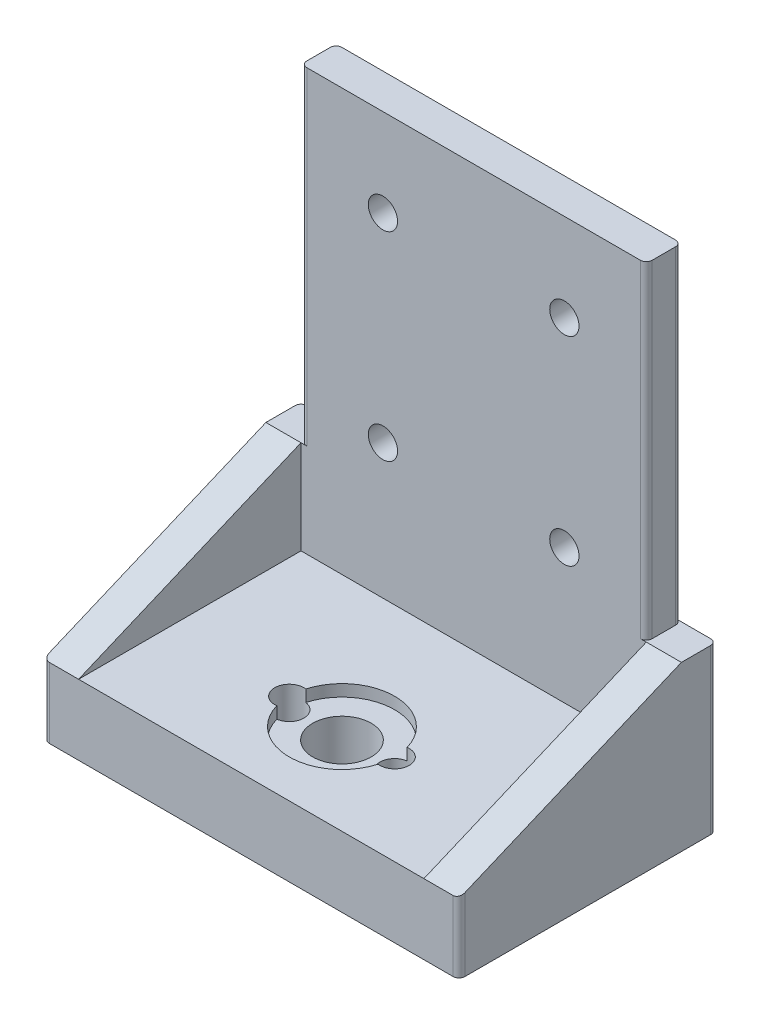
ISO-10303-21;
HEADER;
FILE_DESCRIPTION(('STEP AP214'),'2;1');
FILE_NAME('part.step','',(''),(''),'','','');
FILE_SCHEMA(('AUTOMOTIVE_DESIGN { 1 0 10303 214 1 1 1 1 }'));
ENDSEC;
DATA;
#1=APPLICATION_CONTEXT('core data for automotive mechanical design processes');
#2=APPLICATION_PROTOCOL_DEFINITION('international standard','automotive_design',2000,#1);
#3=PRODUCT_CONTEXT('',#1,'mechanical');
#4=PRODUCT('Part','Part','',(#3));
#5=PRODUCT_RELATED_PRODUCT_CATEGORY('part','',(#4));
#6=PRODUCT_DEFINITION_FORMATION('','',#4);
#7=PRODUCT_DEFINITION_CONTEXT('part definition',#1,'design');
#8=PRODUCT_DEFINITION('design','',#6,#7);
#9=PRODUCT_DEFINITION_SHAPE('','',#8);
#10=(LENGTH_UNIT() NAMED_UNIT(*) SI_UNIT(.MILLI.,.METRE.));
#11=(NAMED_UNIT(*) PLANE_ANGLE_UNIT() SI_UNIT($,.RADIAN.));
#12=(NAMED_UNIT(*) SI_UNIT($,.STERADIAN.) SOLID_ANGLE_UNIT());
#13=UNCERTAINTY_MEASURE_WITH_UNIT(LENGTH_MEASURE(1.E-05),#10,'distance_accuracy_value','');
#14=(GEOMETRIC_REPRESENTATION_CONTEXT(3) GLOBAL_UNCERTAINTY_ASSIGNED_CONTEXT((#13)) GLOBAL_UNIT_ASSIGNED_CONTEXT((#10,
#11,#12)) REPRESENTATION_CONTEXT('',''));
#15=CARTESIAN_POINT('',(0.,0.,0.));
#16=DIRECTION('',(0.,0.,1.));
#17=DIRECTION('',(1.,0.,0.));
#18=AXIS2_PLACEMENT_3D('',#15,#16,#17);
#19=CARTESIAN_POINT('',(17.75,0.,-7.75));
#20=DIRECTION('',(0.,-1.,0.));
#21=DIRECTION('',(0.,0.,-1.));
#22=AXIS2_PLACEMENT_3D('',#19,#20,#21);
#23=CYLINDRICAL_SURFACE('',#22,4.50000000000001);
#24=CARTESIAN_POINT('',(17.75,6.,-7.75));
#25=DIRECTION('',(0.,-1.,0.));
#26=DIRECTION('',(0.,0.,-1.));
#27=AXIS2_PLACEMENT_3D('',#24,#25,#26);
#28=CIRCLE('',#27,4.50000000000001);
#29=CARTESIAN_POINT('',(22.0763888888889,6.,-6.51211503680724));
#30=VERTEX_POINT('',#29);
#31=CARTESIAN_POINT('',(13.4236111111111,6.,-6.51211503680724));
#32=VERTEX_POINT('',#31);
#33=EDGE_CURVE('E227',#30,#32,#28,.T.);
#34=ORIENTED_EDGE('',*,*,#33,.F.);
#35=DIRECTION('',(0.,-1.,0.));
#36=VECTOR('',#35,1.);
#37=CARTESIAN_POINT('',(22.0763888888889,21.,-6.51211503680724));
#38=LINE('',#37,#36);
#39=CARTESIAN_POINT('',(22.0763888888889,5.,-6.51211503680724));
#40=VERTEX_POINT('',#39);
#41=EDGE_CURVE('E210',#30,#40,#38,.T.);
#42=ORIENTED_EDGE('',*,*,#41,.T.);
#43=CARTESIAN_POINT('',(17.75,5.,-7.75));
#44=DIRECTION('',(0.,-1.,0.));
#45=DIRECTION('',(0.,0.,-1.));
#46=AXIS2_PLACEMENT_3D('',#43,#44,#45);
#47=CIRCLE('',#46,4.50000000000001);
#48=CARTESIAN_POINT('',(13.4236111111111,5.,-6.51211503680724));
#49=VERTEX_POINT('',#48);
#50=EDGE_CURVE('E225',#40,#49,#47,.T.);
#51=ORIENTED_EDGE('',*,*,#50,.T.);
#52=DIRECTION('',(0.,-1.,0.));
#53=VECTOR('',#52,1.);
#54=CARTESIAN_POINT('',(13.4236111111111,21.,-6.51211503680724));
#55=LINE('',#54,#53);
#56=EDGE_CURVE('E595',#49,#32,#55,.F.);
#57=ORIENTED_EDGE('',*,*,#56,.T.);
#58=EDGE_LOOP('',(#34,#42,#51,#57));
#59=FACE_BOUND('',#58,.T.);
#60=ADVANCED_FACE('F45',(#59),#23,.F.);
#61=CARTESIAN_POINT('',(0.,6.,0.));
#62=DIRECTION('',(0.,-0.921635375138065,-0.388057000058133));
#63=DIRECTION('',(0.,0.388057000058133,-0.921635375138065));
#64=AXIS2_PLACEMENT_3D('',#61,#62,#63);
#65=PLANE('',#64);
#66=DIRECTION('',(0.,0.388057000058133,-0.921635375138065));
#67=VECTOR('',#66,1.);
#68=CARTESIAN_POINT('',(0.,6.,0.));
#69=LINE('',#68,#67);
#70=CARTESIAN_POINT('',(0.,6.21052631578947,-0.5));
#71=VERTEX_POINT('',#70);
#72=CARTESIAN_POINT('',(0.,14.,-19.));
#73=VERTEX_POINT('',#72);
#74=EDGE_CURVE('E303',#71,#73,#69,.T.);
#75=ORIENTED_EDGE('',*,*,#74,.F.);
#76=CARTESIAN_POINT('',(0.5,6.21052631578947,-0.5));
#77=DIRECTION('',(0.,-0.921635375138065,-0.388057000058133));
#78=DIRECTION('',(0.,-0.388057000058133,0.921635375138065));
#79=AXIS2_PLACEMENT_3D('',#76,#77,#78);
#80=ELLIPSE('',#79,0.542513898107587,0.5);
#81=CARTESIAN_POINT('',(0.5,6.,0.));
#82=VERTEX_POINT('',#81);
#83=EDGE_CURVE('E69',#71,#82,#80,.F.);
#84=ORIENTED_EDGE('',*,*,#83,.T.);
#85=DIRECTION('',(1.,0.,0.));
#86=VECTOR('',#85,1.);
#87=CARTESIAN_POINT('',(0.,6.,0.));
#88=LINE('',#87,#86);
#89=CARTESIAN_POINT('',(3.,6.,0.));
#90=VERTEX_POINT('',#89);
#91=EDGE_CURVE('E318',#82,#90,#88,.T.);
#92=ORIENTED_EDGE('',*,*,#91,.T.);
#93=DIRECTION('',(0.,0.388057000058133,-0.921635375138065));
#94=VECTOR('',#93,1.);
#95=CARTESIAN_POINT('',(3.,6.,0.));
#96=LINE('',#95,#94);
#97=CARTESIAN_POINT('',(3.,14.,-19.));
#98=VERTEX_POINT('',#97);
#99=EDGE_CURVE('E344',#90,#98,#96,.T.);
#100=ORIENTED_EDGE('',*,*,#99,.T.);
#101=DIRECTION('',(1.,0.,0.));
#102=VECTOR('',#101,1.);
#103=CARTESIAN_POINT('',(0.,14.,-19.));
#104=LINE('',#103,#102);
#105=EDGE_CURVE('E314',#73,#98,#104,.T.);
#106=ORIENTED_EDGE('',*,*,#105,.F.);
#107=EDGE_LOOP('',(#75,#84,#92,#100,#106));
#108=FACE_BOUND('',#107,.T.);
#109=ADVANCED_FACE('F524',(#108),#65,.F.);
#110=CARTESIAN_POINT('',(0.,42.,0.));
#111=DIRECTION('',(1.,0.,0.));
#112=DIRECTION('',(0.,0.,-1.));
#113=AXIS2_PLACEMENT_3D('',#110,#111,#112);
#114=PLANE('',#113);
#115=DIRECTION('',(0.,0.,1.));
#116=VECTOR('',#115,1.);
#117=CARTESIAN_POINT('',(0.,14.,-22.));
#118=LINE('',#117,#116);
#119=CARTESIAN_POINT('',(0.,14.,-21.5));
#120=VERTEX_POINT('',#119);
#121=EDGE_CURVE('E269',#120,#73,#118,.T.);
#122=ORIENTED_EDGE('',*,*,#121,.F.);
#123=DIRECTION('',(0.,-1.,0.));
#124=VECTOR('',#123,1.);
#125=CARTESIAN_POINT('',(0.,42.,-21.5));
#126=LINE('',#125,#124);
#127=CARTESIAN_POINT('',(0.,0.,-21.5));
#128=VERTEX_POINT('',#127);
#129=EDGE_CURVE('E427',#120,#128,#126,.T.);
#130=ORIENTED_EDGE('',*,*,#129,.T.);
#131=DIRECTION('',(0.,0.,1.));
#132=VECTOR('',#131,1.);
#133=CARTESIAN_POINT('',(0.,0.,0.));
#134=LINE('',#133,#132);
#135=CARTESIAN_POINT('',(0.,0.,-0.5));
#136=VERTEX_POINT('',#135);
#137=EDGE_CURVE('E313',#128,#136,#134,.T.);
#138=ORIENTED_EDGE('',*,*,#137,.T.);
#139=DIRECTION('',(0.,-1.,0.));
#140=VECTOR('',#139,1.);
#141=CARTESIAN_POINT('',(0.,42.,-0.5));
#142=LINE('',#141,#140);
#143=EDGE_CURVE('E424',#136,#71,#142,.F.);
#144=ORIENTED_EDGE('',*,*,#143,.T.);
#145=ORIENTED_EDGE('',*,*,#74,.T.);
#146=EDGE_LOOP('',(#122,#130,#138,#144,#145));
#147=FACE_BOUND('',#146,.T.);
#148=ADVANCED_FACE('F530',(#147),#114,.F.);
#149=CARTESIAN_POINT('',(0.,42.,0.));
#150=DIRECTION('',(0.,0.,-1.));
#151=DIRECTION('',(-1.,0.,0.));
#152=AXIS2_PLACEMENT_3D('',#149,#150,#151);
#153=PLANE('',#152);
#154=ORIENTED_EDGE('',*,*,#91,.F.);
#155=DIRECTION('',(0.,-1.,0.));
#156=VECTOR('',#155,1.);
#157=CARTESIAN_POINT('',(0.5,42.,0.));
#158=LINE('',#157,#156);
#159=CARTESIAN_POINT('',(0.5,0.,0.));
#160=VERTEX_POINT('',#159);
#161=EDGE_CURVE('E459',#82,#160,#158,.T.);
#162=ORIENTED_EDGE('',*,*,#161,.T.);
#163=DIRECTION('',(1.,0.,0.));
#164=VECTOR('',#163,1.);
#165=CARTESIAN_POINT('',(0.,0.,0.));
#166=LINE('',#165,#164);
#167=CARTESIAN_POINT('',(35.,0.,0.));
#168=VERTEX_POINT('',#167);
#169=EDGE_CURVE('E330',#160,#168,#166,.T.);
#170=ORIENTED_EDGE('',*,*,#169,.T.);
#171=DIRECTION('',(0.,-1.,0.));
#172=VECTOR('',#171,1.);
#173=CARTESIAN_POINT('',(35.,42.,0.));
#174=LINE('',#173,#172);
#175=CARTESIAN_POINT('',(35.,6.,0.));
#176=VERTEX_POINT('',#175);
#177=EDGE_CURVE('E456',#168,#176,#174,.F.);
#178=ORIENTED_EDGE('',*,*,#177,.T.);
#179=CARTESIAN_POINT('',(32.5,6.,0.));
#180=VERTEX_POINT('',#179);
#181=EDGE_CURVE('E306',#180,#176,#88,.T.);
#182=ORIENTED_EDGE('',*,*,#181,.F.);
#183=DIRECTION('',(1.,0.,0.));
#184=VECTOR('',#183,1.);
#185=CARTESIAN_POINT('',(3.,6.,0.));
#186=LINE('',#185,#184);
#187=EDGE_CURVE('E250',#90,#180,#186,.T.);
#188=ORIENTED_EDGE('',*,*,#187,.F.);
#189=EDGE_LOOP('',(#154,#162,#170,#178,#182,#188));
#190=FACE_BOUND('',#189,.T.);
#191=ADVANCED_FACE('F554',(#190),#153,.F.);
#192=CARTESIAN_POINT('',(35.5,42.,0.));
#193=DIRECTION('',(-1.,0.,0.));
#194=DIRECTION('',(0.,0.,1.));
#195=AXIS2_PLACEMENT_3D('',#192,#193,#194);
#196=PLANE('',#195);
#197=DIRECTION('',(0.,0.,-1.));
#198=VECTOR('',#197,1.);
#199=CARTESIAN_POINT('',(35.5,0.,0.));
#200=LINE('',#199,#198);
#201=CARTESIAN_POINT('',(35.5,0.,-0.5));
#202=VERTEX_POINT('',#201);
#203=CARTESIAN_POINT('',(35.5,0.,-21.5));
#204=VERTEX_POINT('',#203);
#205=EDGE_CURVE('E334',#202,#204,#200,.T.);
#206=ORIENTED_EDGE('',*,*,#205,.T.);
#207=DIRECTION('',(0.,-1.,0.));
#208=VECTOR('',#207,1.);
#209=CARTESIAN_POINT('',(35.5,42.,-21.5));
#210=LINE('',#209,#208);
#211=CARTESIAN_POINT('',(35.5,14.,-21.5));
#212=VERTEX_POINT('',#211);
#213=EDGE_CURVE('E450',#204,#212,#210,.F.);
#214=ORIENTED_EDGE('',*,*,#213,.T.);
#215=DIRECTION('',(0.,0.,-1.));
#216=VECTOR('',#215,1.);
#217=CARTESIAN_POINT('',(35.5,14.,-22.));
#218=LINE('',#217,#216);
#219=CARTESIAN_POINT('',(35.5,14.,-19.));
#220=VERTEX_POINT('',#219);
#221=EDGE_CURVE('E290',#220,#212,#218,.T.);
#222=ORIENTED_EDGE('',*,*,#221,.F.);
#223=DIRECTION('',(0.,0.388057000058133,-0.921635375138065));
#224=VECTOR('',#223,1.);
#225=CARTESIAN_POINT('',(35.5,6.,0.));
#226=LINE('',#225,#224);
#227=CARTESIAN_POINT('',(35.5,6.21052631578947,-0.5));
#228=VERTEX_POINT('',#227);
#229=EDGE_CURVE('E282',#228,#220,#226,.T.);
#230=ORIENTED_EDGE('',*,*,#229,.F.);
#231=DIRECTION('',(0.,-1.,0.));
#232=VECTOR('',#231,1.);
#233=CARTESIAN_POINT('',(35.5,42.,-0.5));
#234=LINE('',#233,#232);
#235=EDGE_CURVE('E446',#228,#202,#234,.T.);
#236=ORIENTED_EDGE('',*,*,#235,.T.);
#237=EDGE_LOOP('',(#206,#214,#222,#230,#236));
#238=FACE_BOUND('',#237,.T.);
#239=ADVANCED_FACE('F545',(#238),#196,.F.);
#240=CARTESIAN_POINT('',(0.,42.,-22.));
#241=DIRECTION('',(0.,0.,1.));
#242=DIRECTION('',(1.,0.,0.));
#243=AXIS2_PLACEMENT_3D('',#240,#241,#242);
#244=PLANE('',#243);
#245=CARTESIAN_POINT('',(10.,17.5,-22.));
#246=DIRECTION('',(0.,0.,-1.));
#247=DIRECTION('',(-1.,0.,0.));
#248=AXIS2_PLACEMENT_3D('',#245,#246,#247);
#249=CIRCLE('',#248,1.25);
#250=CARTESIAN_POINT('',(8.75,17.5,-22.));
#251=VERTEX_POINT('',#250);
#252=EDGE_CURVE('E370',#251,#251,#249,.T.);
#253=ORIENTED_EDGE('',*,*,#252,.F.);
#254=EDGE_LOOP('',(#253));
#255=FACE_BOUND('',#254,.T.);
#256=CARTESIAN_POINT('',(25.5,17.5,-22.));
#257=DIRECTION('',(0.,0.,-1.));
#258=DIRECTION('',(-1.,0.,0.));
#259=AXIS2_PLACEMENT_3D('',#256,#257,#258);
#260=CIRCLE('',#259,1.25);
#261=CARTESIAN_POINT('',(24.25,17.5,-22.));
#262=VERTEX_POINT('',#261);
#263=EDGE_CURVE('E369',#262,#262,#260,.T.);
#264=ORIENTED_EDGE('',*,*,#263,.F.);
#265=EDGE_LOOP('',(#264));
#266=FACE_BOUND('',#265,.T.);
#267=CARTESIAN_POINT('',(25.5,34.5,-22.));
#268=DIRECTION('',(0.,0.,-1.));
#269=DIRECTION('',(-1.,0.,0.));
#270=AXIS2_PLACEMENT_3D('',#267,#268,#269);
#271=CIRCLE('',#270,1.25);
#272=CARTESIAN_POINT('',(24.25,34.5,-22.));
#273=VERTEX_POINT('',#272);
#274=EDGE_CURVE('E364',#273,#273,#271,.T.);
#275=ORIENTED_EDGE('',*,*,#274,.F.);
#276=EDGE_LOOP('',(#275));
#277=FACE_BOUND('',#276,.T.);
#278=CARTESIAN_POINT('',(10.,34.5,-22.));
#279=DIRECTION('',(0.,0.,-1.));
#280=DIRECTION('',(-1.,0.,0.));
#281=AXIS2_PLACEMENT_3D('',#278,#279,#280);
#282=CIRCLE('',#281,1.25);
#283=CARTESIAN_POINT('',(8.75,34.5,-22.));
#284=VERTEX_POINT('',#283);
#285=EDGE_CURVE('E359',#284,#284,#282,.T.);
#286=ORIENTED_EDGE('',*,*,#285,.F.);
#287=EDGE_LOOP('',(#286));
#288=FACE_BOUND('',#287,.T.);
#289=DIRECTION('',(-1.,0.,0.));
#290=VECTOR('',#289,1.);
#291=CARTESIAN_POINT('',(0.,14.,-22.));
#292=LINE('',#291,#290);
#293=CARTESIAN_POINT('',(3.5,14.,-22.));
#294=VERTEX_POINT('',#293);
#295=CARTESIAN_POINT('',(0.5,14.,-22.));
#296=VERTEX_POINT('',#295);
#297=EDGE_CURVE('E278',#294,#296,#292,.T.);
#298=ORIENTED_EDGE('',*,*,#297,.F.);
#299=DIRECTION('',(0.,1.,0.));
#300=VECTOR('',#299,1.);
#301=CARTESIAN_POINT('',(3.5,42.,-22.));
#302=LINE('',#301,#300);
#303=CARTESIAN_POINT('',(3.5,42.,-22.));
#304=VERTEX_POINT('',#303);
#305=EDGE_CURVE('E381',#294,#304,#302,.T.);
#306=ORIENTED_EDGE('',*,*,#305,.T.);
#307=DIRECTION('',(-1.,0.,0.));
#308=VECTOR('',#307,1.);
#309=CARTESIAN_POINT('',(0.,42.,-22.));
#310=LINE('',#309,#308);
#311=CARTESIAN_POINT('',(32.,42.,-22.));
#312=VERTEX_POINT('',#311);
#313=EDGE_CURVE('E321',#312,#304,#310,.T.);
#314=ORIENTED_EDGE('',*,*,#313,.F.);
#315=DIRECTION('',(0.,1.,0.));
#316=VECTOR('',#315,1.);
#317=CARTESIAN_POINT('',(32.,42.,-22.));
#318=LINE('',#317,#316);
#319=CARTESIAN_POINT('',(32.,14.,-22.));
#320=VERTEX_POINT('',#319);
#321=EDGE_CURVE('E377',#312,#320,#318,.F.);
#322=ORIENTED_EDGE('',*,*,#321,.T.);
#323=DIRECTION('',(-1.,0.,0.));
#324=VECTOR('',#323,1.);
#325=CARTESIAN_POINT('',(35.5,14.,-22.));
#326=LINE('',#325,#324);
#327=CARTESIAN_POINT('',(35.,14.,-22.));
#328=VERTEX_POINT('',#327);
#329=EDGE_CURVE('E297',#328,#320,#326,.T.);
#330=ORIENTED_EDGE('',*,*,#329,.F.);
#331=DIRECTION('',(0.,-1.,0.));
#332=VECTOR('',#331,1.);
#333=CARTESIAN_POINT('',(35.,42.,-22.));
#334=LINE('',#333,#332);
#335=CARTESIAN_POINT('',(35.,0.,-22.));
#336=VERTEX_POINT('',#335);
#337=EDGE_CURVE('E219',#328,#336,#334,.T.);
#338=ORIENTED_EDGE('',*,*,#337,.T.);
#339=DIRECTION('',(-1.,0.,0.));
#340=VECTOR('',#339,1.);
#341=CARTESIAN_POINT('',(0.,0.,-22.));
#342=LINE('',#341,#340);
#343=CARTESIAN_POINT('',(0.5,0.,-22.));
#344=VERTEX_POINT('',#343);
#345=EDGE_CURVE('E326',#336,#344,#342,.T.);
#346=ORIENTED_EDGE('',*,*,#345,.T.);
#347=DIRECTION('',(0.,-1.,0.));
#348=VECTOR('',#347,1.);
#349=CARTESIAN_POINT('',(0.5,42.,-22.));
#350=LINE('',#349,#348);
#351=EDGE_CURVE('E374',#344,#296,#350,.F.);
#352=ORIENTED_EDGE('',*,*,#351,.T.);
#353=EDGE_LOOP('',(#298,#306,#314,#322,#330,#338,#346,#352));
#354=FACE_BOUND('',#353,.T.);
#355=ADVANCED_FACE('F499',(#255,#266,#277,#288,#354),#244,.F.);
#356=CARTESIAN_POINT('',(0.,42.,0.));
#357=DIRECTION('',(0.,-1.,0.));
#358=DIRECTION('',(0.,0.,-1.));
#359=AXIS2_PLACEMENT_3D('',#356,#357,#358);
#360=PLANE('',#359);
#361=ORIENTED_EDGE('',*,*,#313,.T.);
#362=CARTESIAN_POINT('',(3.5,42.,-21.5));
#363=DIRECTION('',(0.,-1.,0.));
#364=DIRECTION('',(0.,0.,-1.));
#365=AXIS2_PLACEMENT_3D('',#362,#363,#364);
#366=CIRCLE('',#365,0.5);
#367=CARTESIAN_POINT('',(3.,42.,-21.5));
#368=VERTEX_POINT('',#367);
#369=EDGE_CURVE('E394',#304,#368,#366,.F.);
#370=ORIENTED_EDGE('',*,*,#369,.T.);
#371=DIRECTION('',(0.,0.,-1.));
#372=VECTOR('',#371,1.);
#373=CARTESIAN_POINT('',(3.,42.,-22.));
#374=LINE('',#373,#372);
#375=CARTESIAN_POINT('',(3.,42.,-19.5));
#376=VERTEX_POINT('',#375);
#377=EDGE_CURVE('E274',#376,#368,#374,.T.);
#378=ORIENTED_EDGE('',*,*,#377,.F.);
#379=CARTESIAN_POINT('',(3.5,42.,-19.5));
#380=DIRECTION('',(0.,-1.,0.));
#381=DIRECTION('',(0.,0.,-1.));
#382=AXIS2_PLACEMENT_3D('',#379,#380,#381);
#383=CIRCLE('',#382,0.5);
#384=CARTESIAN_POINT('',(3.5,42.,-19.));
#385=VERTEX_POINT('',#384);
#386=EDGE_CURVE('E385',#376,#385,#383,.F.);
#387=ORIENTED_EDGE('',*,*,#386,.T.);
#388=DIRECTION('',(1.,0.,0.));
#389=VECTOR('',#388,1.);
#390=CARTESIAN_POINT('',(0.,42.,-19.));
#391=LINE('',#390,#389);
#392=CARTESIAN_POINT('',(32.,42.,-19.));
#393=VERTEX_POINT('',#392);
#394=EDGE_CURVE('E309',#385,#393,#391,.T.);
#395=ORIENTED_EDGE('',*,*,#394,.T.);
#396=CARTESIAN_POINT('',(32.,42.,-19.5));
#397=DIRECTION('',(0.,-1.,0.));
#398=DIRECTION('',(0.,0.,-1.));
#399=AXIS2_PLACEMENT_3D('',#396,#397,#398);
#400=CIRCLE('',#399,0.5);
#401=CARTESIAN_POINT('',(32.5,42.,-19.5));
#402=VERTEX_POINT('',#401);
#403=EDGE_CURVE('E388',#393,#402,#400,.F.);
#404=ORIENTED_EDGE('',*,*,#403,.T.);
#405=DIRECTION('',(0.,0.,1.));
#406=VECTOR('',#405,1.);
#407=CARTESIAN_POINT('',(32.5,42.,-22.));
#408=LINE('',#407,#406);
#409=CARTESIAN_POINT('',(32.5,42.,-21.5));
#410=VERTEX_POINT('',#409);
#411=EDGE_CURVE('E286',#410,#402,#408,.T.);
#412=ORIENTED_EDGE('',*,*,#411,.F.);
#413=CARTESIAN_POINT('',(32.,42.,-21.5));
#414=DIRECTION('',(0.,-1.,0.));
#415=DIRECTION('',(0.,0.,-1.));
#416=AXIS2_PLACEMENT_3D('',#413,#414,#415);
#417=CIRCLE('',#416,0.5);
#418=EDGE_CURVE('E391',#410,#312,#417,.F.);
#419=ORIENTED_EDGE('',*,*,#418,.T.);
#420=EDGE_LOOP('',(#361,#370,#378,#387,#395,#404,#412,#419));
#421=FACE_BOUND('',#420,.T.);
#422=ADVANCED_FACE('F489',(#421),#360,.F.);
#423=CARTESIAN_POINT('',(0.,0.,0.));
#424=DIRECTION('',(0.,-1.,0.));
#425=DIRECTION('',(0.,0.,-1.));
#426=AXIS2_PLACEMENT_3D('',#423,#424,#425);
#427=PLANE('',#426);
#428=CARTESIAN_POINT('',(22.25,0.,-7.75));
#429=DIRECTION('',(0.,-1.,0.));
#430=DIRECTION('',(0.,0.,-1.));
#431=AXIS2_PLACEMENT_3D('',#428,#429,#430);
#432=CIRCLE('',#431,1.24999999999999);
#433=CARTESIAN_POINT('',(22.25,0.,-8.99999999999999));
#434=VERTEX_POINT('',#433);
#435=EDGE_CURVE('E358',#434,#434,#432,.T.);
#436=ORIENTED_EDGE('',*,*,#435,.F.);
#437=EDGE_LOOP('',(#436));
#438=FACE_BOUND('',#437,.T.);
#439=CARTESIAN_POINT('',(13.25,0.,-7.75));
#440=DIRECTION('',(0.,-1.,0.));
#441=DIRECTION('',(0.,0.,-1.));
#442=AXIS2_PLACEMENT_3D('',#439,#440,#441);
#443=CIRCLE('',#442,1.24999999999999);
#444=CARTESIAN_POINT('',(13.25,0.,-8.99999999999999));
#445=VERTEX_POINT('',#444);
#446=EDGE_CURVE('E600',#445,#445,#443,.T.);
#447=ORIENTED_EDGE('',*,*,#446,.F.);
#448=EDGE_LOOP('',(#447));
#449=FACE_BOUND('',#448,.T.);
#450=CARTESIAN_POINT('',(17.75,0.,-7.75));
#451=DIRECTION('',(0.,-1.,0.));
#452=DIRECTION('',(0.,0.,-1.));
#453=AXIS2_PLACEMENT_3D('',#450,#451,#452);
#454=CIRCLE('',#453,2.50000000000001);
#455=CARTESIAN_POINT('',(17.75,0.,-10.25));
#456=VERTEX_POINT('',#455);
#457=EDGE_CURVE('E242',#456,#456,#454,.T.);
#458=ORIENTED_EDGE('',*,*,#457,.F.);
#459=EDGE_LOOP('',(#458));
#460=FACE_BOUND('',#459,.T.);
#461=ORIENTED_EDGE('',*,*,#137,.F.);
#462=CARTESIAN_POINT('',(0.5,0.,-21.5));
#463=DIRECTION('',(0.,-1.,0.));
#464=DIRECTION('',(0.,0.,-1.));
#465=AXIS2_PLACEMENT_3D('',#462,#463,#464);
#466=CIRCLE('',#465,0.5);
#467=EDGE_CURVE('E440',#128,#344,#466,.T.);
#468=ORIENTED_EDGE('',*,*,#467,.T.);
#469=ORIENTED_EDGE('',*,*,#345,.F.);
#470=CARTESIAN_POINT('',(35.,0.,-21.5));
#471=DIRECTION('',(0.,-1.,0.));
#472=DIRECTION('',(0.,0.,-1.));
#473=AXIS2_PLACEMENT_3D('',#470,#471,#472);
#474=CIRCLE('',#473,0.5);
#475=EDGE_CURVE('E437',#336,#204,#474,.T.);
#476=ORIENTED_EDGE('',*,*,#475,.T.);
#477=ORIENTED_EDGE('',*,*,#205,.F.);
#478=CARTESIAN_POINT('',(35.,0.,-0.5));
#479=DIRECTION('',(0.,-1.,0.));
#480=DIRECTION('',(0.,0.,-1.));
#481=AXIS2_PLACEMENT_3D('',#478,#479,#480);
#482=CIRCLE('',#481,0.5);
#483=EDGE_CURVE('E431',#202,#168,#482,.T.);
#484=ORIENTED_EDGE('',*,*,#483,.T.);
#485=ORIENTED_EDGE('',*,*,#169,.F.);
#486=CARTESIAN_POINT('',(0.5,0.,-0.5));
#487=DIRECTION('',(0.,-1.,0.));
#488=DIRECTION('',(0.,0.,-1.));
#489=AXIS2_PLACEMENT_3D('',#486,#487,#488);
#490=CIRCLE('',#489,0.5);
#491=EDGE_CURVE('E434',#160,#136,#490,.T.);
#492=ORIENTED_EDGE('',*,*,#491,.T.);
#493=EDGE_LOOP('',(#461,#468,#469,#476,#477,#484,#485,#492));
#494=FACE_BOUND('',#493,.T.);
#495=ADVANCED_FACE('F537',(#438,#449,#460,#494),#427,.T.);
#496=CARTESIAN_POINT('',(0.,14.,-19.));
#497=DIRECTION('',(0.,0.,-1.));
#498=DIRECTION('',(-1.,0.,0.));
#499=AXIS2_PLACEMENT_3D('',#496,#497,#498);
#500=PLANE('',#499);
#501=CARTESIAN_POINT('',(10.,17.5,-19.));
#502=DIRECTION('',(0.,0.,-1.));
#503=DIRECTION('',(-1.,0.,0.));
#504=AXIS2_PLACEMENT_3D('',#501,#502,#503);
#505=CIRCLE('',#504,1.25);
#506=CARTESIAN_POINT('',(8.75,17.5,-19.));
#507=VERTEX_POINT('',#506);
#508=EDGE_CURVE('E365',#507,#507,#505,.T.);
#509=ORIENTED_EDGE('',*,*,#508,.T.);
#510=EDGE_LOOP('',(#509));
#511=FACE_BOUND('',#510,.T.);
#512=CARTESIAN_POINT('',(25.5,17.5,-19.));
#513=DIRECTION('',(0.,0.,-1.));
#514=DIRECTION('',(-1.,0.,0.));
#515=AXIS2_PLACEMENT_3D('',#512,#513,#514);
#516=CIRCLE('',#515,1.25);
#517=CARTESIAN_POINT('',(24.25,17.5,-19.));
#518=VERTEX_POINT('',#517);
#519=EDGE_CURVE('E886',#518,#518,#516,.T.);
#520=ORIENTED_EDGE('',*,*,#519,.T.);
#521=EDGE_LOOP('',(#520));
#522=FACE_BOUND('',#521,.T.);
#523=CARTESIAN_POINT('',(25.5,34.5,-19.));
#524=DIRECTION('',(0.,0.,-1.));
#525=DIRECTION('',(-1.,0.,0.));
#526=AXIS2_PLACEMENT_3D('',#523,#524,#525);
#527=CIRCLE('',#526,1.25);
#528=CARTESIAN_POINT('',(24.25,34.5,-19.));
#529=VERTEX_POINT('',#528);
#530=EDGE_CURVE('E360',#529,#529,#527,.T.);
#531=ORIENTED_EDGE('',*,*,#530,.T.);
#532=EDGE_LOOP('',(#531));
#533=FACE_BOUND('',#532,.T.);
#534=CARTESIAN_POINT('',(10.,34.5,-19.));
#535=DIRECTION('',(0.,0.,-1.));
#536=DIRECTION('',(-1.,0.,0.));
#537=AXIS2_PLACEMENT_3D('',#534,#535,#536);
#538=CIRCLE('',#537,1.25);
#539=CARTESIAN_POINT('',(8.75,34.5,-19.));
#540=VERTEX_POINT('',#539);
#541=EDGE_CURVE('E354',#540,#540,#538,.T.);
#542=ORIENTED_EDGE('',*,*,#541,.T.);
#543=EDGE_LOOP('',(#542));
#544=FACE_BOUND('',#543,.T.);
#545=DIRECTION('',(-1.,0.,0.));
#546=VECTOR('',#545,1.);
#547=CARTESIAN_POINT('',(0.,14.,-19.));
#548=LINE('',#547,#546);
#549=CARTESIAN_POINT('',(32.5,14.,-19.));
#550=VERTEX_POINT('',#549);
#551=CARTESIAN_POINT('',(32.,14.,-19.));
#552=VERTEX_POINT('',#551);
#553=EDGE_CURVE('E61',#550,#552,#548,.T.);
#554=ORIENTED_EDGE('',*,*,#553,.T.);
#555=DIRECTION('',(0.,1.,0.));
#556=VECTOR('',#555,1.);
#557=CARTESIAN_POINT('',(32.,14.,-19.));
#558=LINE('',#557,#556);
#559=EDGE_CURVE('E420',#552,#393,#558,.T.);
#560=ORIENTED_EDGE('',*,*,#559,.T.);
#561=ORIENTED_EDGE('',*,*,#394,.F.);
#562=DIRECTION('',(0.,1.,0.));
#563=VECTOR('',#562,1.);
#564=CARTESIAN_POINT('',(3.5,14.,-19.));
#565=LINE('',#564,#563);
#566=CARTESIAN_POINT('',(3.5,14.,-19.));
#567=VERTEX_POINT('',#566);
#568=EDGE_CURVE('E414',#385,#567,#565,.F.);
#569=ORIENTED_EDGE('',*,*,#568,.T.);
#570=DIRECTION('',(-1.,0.,0.));
#571=VECTOR('',#570,1.);
#572=CARTESIAN_POINT('',(0.,14.,-19.));
#573=LINE('',#572,#571);
#574=EDGE_CURVE('E411',#567,#98,#573,.T.);
#575=ORIENTED_EDGE('',*,*,#574,.T.);
#576=DIRECTION('',(0.,-1.,0.));
#577=VECTOR('',#576,1.);
#578=CARTESIAN_POINT('',(3.,6.,-19.));
#579=LINE('',#578,#577);
#580=CARTESIAN_POINT('',(3.,6.,-19.));
#581=VERTEX_POINT('',#580);
#582=EDGE_CURVE('E246',#98,#581,#579,.T.);
#583=ORIENTED_EDGE('',*,*,#582,.T.);
#584=DIRECTION('',(1.,0.,0.));
#585=VECTOR('',#584,1.);
#586=CARTESIAN_POINT('',(3.,6.,-19.));
#587=LINE('',#586,#585);
#588=CARTESIAN_POINT('',(32.5,6.,-19.));
#589=VERTEX_POINT('',#588);
#590=EDGE_CURVE('E249',#581,#589,#587,.T.);
#591=ORIENTED_EDGE('',*,*,#590,.T.);
#592=DIRECTION('',(0.,1.,0.));
#593=VECTOR('',#592,1.);
#594=CARTESIAN_POINT('',(32.5,6.,-19.));
#595=LINE('',#594,#593);
#596=EDGE_CURVE('E254',#589,#550,#595,.T.);
#597=ORIENTED_EDGE('',*,*,#596,.T.);
#598=EDGE_LOOP('',(#554,#560,#561,#569,#575,#583,#591,#597));
#599=FACE_BOUND('',#598,.T.);
#600=ADVANCED_FACE('F482',(#511,#522,#533,#544,#599),#500,.F.);
#601=ORIENTED_EDGE('',*,*,#181,.T.);
#602=CARTESIAN_POINT('',(35.,6.21052631578947,-0.5));
#603=DIRECTION('',(0.,-0.921635375138065,-0.388057000058133));
#604=DIRECTION('',(0.,-0.388057000058133,0.921635375138065));
#605=AXIS2_PLACEMENT_3D('',#602,#603,#604);
#606=ELLIPSE('',#605,0.542513898107587,0.5);
#607=EDGE_CURVE('E465',#176,#228,#606,.F.);
#608=ORIENTED_EDGE('',*,*,#607,.T.);
#609=ORIENTED_EDGE('',*,*,#229,.T.);
#610=DIRECTION('',(1.,0.,0.));
#611=VECTOR('',#610,1.);
#612=CARTESIAN_POINT('',(35.5,14.,-19.));
#613=LINE('',#612,#611);
#614=EDGE_CURVE('E265',#550,#220,#613,.T.);
#615=ORIENTED_EDGE('',*,*,#614,.F.);
#616=DIRECTION('',(0.,-0.388057000058133,0.921635375138065));
#617=VECTOR('',#616,1.);
#618=CARTESIAN_POINT('',(32.5,6.,0.));
#619=LINE('',#618,#617);
#620=EDGE_CURVE('E325',#550,#180,#619,.T.);
#621=ORIENTED_EDGE('',*,*,#620,.T.);
#622=EDGE_LOOP('',(#601,#608,#609,#615,#621));
#623=FACE_BOUND('',#622,.T.);
#624=ADVANCED_FACE('F576',(#623),#65,.F.);
#625=CARTESIAN_POINT('',(32.5,14.,-22.));
#626=DIRECTION('',(-1.,0.,0.));
#627=DIRECTION('',(0.,0.,1.));
#628=AXIS2_PLACEMENT_3D('',#625,#626,#627);
#629=PLANE('',#628);
#630=DIRECTION('',(0.,0.,1.));
#631=VECTOR('',#630,1.);
#632=CARTESIAN_POINT('',(32.5,14.,-22.));
#633=LINE('',#632,#631);
#634=CARTESIAN_POINT('',(32.5,14.,-21.5));
#635=VERTEX_POINT('',#634);
#636=CARTESIAN_POINT('',(32.5,14.,-19.5));
#637=VERTEX_POINT('',#636);
#638=EDGE_CURVE('E293',#635,#637,#633,.T.);
#639=ORIENTED_EDGE('',*,*,#638,.F.);
#640=DIRECTION('',(0.,1.,0.));
#641=VECTOR('',#640,1.);
#642=CARTESIAN_POINT('',(32.5,14.,-21.5));
#643=LINE('',#642,#641);
#644=EDGE_CURVE('E407',#635,#410,#643,.T.);
#645=ORIENTED_EDGE('',*,*,#644,.T.);
#646=ORIENTED_EDGE('',*,*,#411,.T.);
#647=DIRECTION('',(0.,1.,0.));
#648=VECTOR('',#647,1.);
#649=CARTESIAN_POINT('',(32.5,14.,-19.5));
#650=LINE('',#649,#648);
#651=EDGE_CURVE('E404',#402,#637,#650,.F.);
#652=ORIENTED_EDGE('',*,*,#651,.T.);
#653=EDGE_LOOP('',(#639,#645,#646,#652));
#654=FACE_BOUND('',#653,.T.);
#655=ADVANCED_FACE('F491',(#654),#629,.F.);
#656=CARTESIAN_POINT('',(0.,14.,0.));
#657=DIRECTION('',(0.,-1.,0.));
#658=DIRECTION('',(0.,0.,-1.));
#659=AXIS2_PLACEMENT_3D('',#656,#657,#658);
#660=PLANE('',#659);
#661=ORIENTED_EDGE('',*,*,#221,.T.);
#662=CARTESIAN_POINT('',(35.,14.,-21.5));
#663=DIRECTION('',(0.,-1.,0.));
#664=DIRECTION('',(0.,0.,-1.));
#665=AXIS2_PLACEMENT_3D('',#662,#663,#664);
#666=CIRCLE('',#665,0.5);
#667=EDGE_CURVE('E453',#212,#328,#666,.F.);
#668=ORIENTED_EDGE('',*,*,#667,.T.);
#669=ORIENTED_EDGE('',*,*,#329,.T.);
#670=CARTESIAN_POINT('',(32.,14.,-21.5));
#671=DIRECTION('',(0.,-1.,0.));
#672=DIRECTION('',(0.,0.,-1.));
#673=AXIS2_PLACEMENT_3D('',#670,#671,#672);
#674=CIRCLE('',#673,0.5);
#675=EDGE_CURVE('E472',#320,#635,#674,.T.);
#676=ORIENTED_EDGE('',*,*,#675,.T.);
#677=ORIENTED_EDGE('',*,*,#638,.T.);
#678=CARTESIAN_POINT('',(32.,14.,-19.5));
#679=DIRECTION('',(0.,-1.,0.));
#680=DIRECTION('',(0.,0.,-1.));
#681=AXIS2_PLACEMENT_3D('',#678,#679,#680);
#682=CIRCLE('',#681,0.5);
#683=EDGE_CURVE('E54',#637,#552,#682,.T.);
#684=ORIENTED_EDGE('',*,*,#683,.T.);
#685=ORIENTED_EDGE('',*,*,#553,.F.);
#686=ORIENTED_EDGE('',*,*,#614,.T.);
#687=EDGE_LOOP('',(#661,#668,#669,#676,#677,#684,#685,#686));
#688=FACE_BOUND('',#687,.T.);
#689=ADVANCED_FACE('F476',(#688),#660,.F.);
#690=CARTESIAN_POINT('',(3.,14.,-22.));
#691=DIRECTION('',(1.,0.,0.));
#692=DIRECTION('',(0.,0.,-1.));
#693=AXIS2_PLACEMENT_3D('',#690,#691,#692);
#694=PLANE('',#693);
#695=ORIENTED_EDGE('',*,*,#377,.T.);
#696=DIRECTION('',(0.,1.,0.));
#697=VECTOR('',#696,1.);
#698=CARTESIAN_POINT('',(3.,14.,-21.5));
#699=LINE('',#698,#697);
#700=CARTESIAN_POINT('',(3.,14.,-21.5));
#701=VERTEX_POINT('',#700);
#702=EDGE_CURVE('E401',#368,#701,#699,.F.);
#703=ORIENTED_EDGE('',*,*,#702,.T.);
#704=DIRECTION('',(0.,0.,-1.));
#705=VECTOR('',#704,1.);
#706=CARTESIAN_POINT('',(3.,14.,-22.));
#707=LINE('',#706,#705);
#708=CARTESIAN_POINT('',(3.,14.,-19.5));
#709=VERTEX_POINT('',#708);
#710=EDGE_CURVE('E273',#709,#701,#707,.T.);
#711=ORIENTED_EDGE('',*,*,#710,.F.);
#712=DIRECTION('',(0.,1.,0.));
#713=VECTOR('',#712,1.);
#714=CARTESIAN_POINT('',(3.,14.,-19.5));
#715=LINE('',#714,#713);
#716=EDGE_CURVE('E397',#709,#376,#715,.T.);
#717=ORIENTED_EDGE('',*,*,#716,.T.);
#718=EDGE_LOOP('',(#695,#703,#711,#717));
#719=FACE_BOUND('',#718,.T.);
#720=ADVANCED_FACE('F508',(#719),#694,.F.);
#721=CARTESIAN_POINT('',(0.,14.,0.));
#722=DIRECTION('',(0.,1.,0.));
#723=DIRECTION('',(0.,0.,1.));
#724=AXIS2_PLACEMENT_3D('',#721,#722,#723);
#725=PLANE('',#724);
#726=ORIENTED_EDGE('',*,*,#297,.T.);
#727=CARTESIAN_POINT('',(0.5,14.,-21.5));
#728=DIRECTION('',(0.,1.,0.));
#729=DIRECTION('',(0.,0.,1.));
#730=AXIS2_PLACEMENT_3D('',#727,#728,#729);
#731=CIRCLE('',#730,0.5);
#732=EDGE_CURVE('E443',#296,#120,#731,.T.);
#733=ORIENTED_EDGE('',*,*,#732,.T.);
#734=ORIENTED_EDGE('',*,*,#121,.T.);
#735=ORIENTED_EDGE('',*,*,#105,.T.);
#736=ORIENTED_EDGE('',*,*,#574,.F.);
#737=CARTESIAN_POINT('',(3.5,14.,-19.5));
#738=DIRECTION('',(0.,1.,0.));
#739=DIRECTION('',(0.,0.,1.));
#740=AXIS2_PLACEMENT_3D('',#737,#738,#739);
#741=CIRCLE('',#740,0.5);
#742=EDGE_CURVE('E11',#567,#709,#741,.F.);
#743=ORIENTED_EDGE('',*,*,#742,.T.);
#744=ORIENTED_EDGE('',*,*,#710,.T.);
#745=CARTESIAN_POINT('',(3.5,14.,-21.5));
#746=DIRECTION('',(0.,1.,0.));
#747=DIRECTION('',(0.,0.,1.));
#748=AXIS2_PLACEMENT_3D('',#745,#746,#747);
#749=CIRCLE('',#748,0.5);
#750=EDGE_CURVE('E468',#701,#294,#749,.F.);
#751=ORIENTED_EDGE('',*,*,#750,.T.);
#752=EDGE_LOOP('',(#726,#733,#734,#735,#736,#743,#744,#751));
#753=FACE_BOUND('',#752,.T.);
#754=ADVANCED_FACE('F525',(#753),#725,.T.);
#755=CARTESIAN_POINT('',(3.,6.,-19.));
#756=DIRECTION('',(-1.,0.,0.));
#757=DIRECTION('',(0.,0.,1.));
#758=AXIS2_PLACEMENT_3D('',#755,#756,#757);
#759=PLANE('',#758);
#760=DIRECTION('',(0.,0.,1.));
#761=VECTOR('',#760,1.);
#762=CARTESIAN_POINT('',(3.,6.,-19.));
#763=LINE('',#762,#761);
#764=EDGE_CURVE('E257',#581,#90,#763,.T.);
#765=ORIENTED_EDGE('',*,*,#764,.F.);
#766=ORIENTED_EDGE('',*,*,#582,.F.);
#767=ORIENTED_EDGE('',*,*,#99,.F.);
#768=EDGE_LOOP('',(#765,#766,#767));
#769=FACE_BOUND('',#768,.T.);
#770=ADVANCED_FACE('F520',(#769),#759,.F.);
#771=CARTESIAN_POINT('',(32.5,6.,-19.));
#772=DIRECTION('',(1.,0.,0.));
#773=DIRECTION('',(0.,0.,-1.));
#774=AXIS2_PLACEMENT_3D('',#771,#772,#773);
#775=PLANE('',#774);
#776=ORIENTED_EDGE('',*,*,#596,.F.);
#777=DIRECTION('',(0.,0.,1.));
#778=VECTOR('',#777,1.);
#779=CARTESIAN_POINT('',(32.5,6.,-19.));
#780=LINE('',#779,#778);
#781=EDGE_CURVE('E262',#589,#180,#780,.T.);
#782=ORIENTED_EDGE('',*,*,#781,.T.);
#783=ORIENTED_EDGE('',*,*,#620,.F.);
#784=EDGE_LOOP('',(#776,#782,#783));
#785=FACE_BOUND('',#784,.T.);
#786=ADVANCED_FACE('F586',(#785),#775,.F.);
#787=CARTESIAN_POINT('',(3.,6.,-19.));
#788=DIRECTION('',(0.,-1.,0.));
#789=DIRECTION('',(0.,0.,-1.));
#790=AXIS2_PLACEMENT_3D('',#787,#788,#789);
#791=PLANE('',#790);
#792=CARTESIAN_POINT('',(13.4236111111111,6.,-8.98788496319276));
#793=VERTEX_POINT('',#792);
#794=CARTESIAN_POINT('',(22.0763888888889,6.,-8.98788496319277));
#795=VERTEX_POINT('',#794);
#796=EDGE_CURVE('E261',#793,#795,#28,.T.);
#797=ORIENTED_EDGE('',*,*,#796,.T.);
#798=CARTESIAN_POINT('',(22.25,6.,-7.75));
#799=DIRECTION('',(0.,-1.,0.));
#800=DIRECTION('',(0.,0.,-1.));
#801=AXIS2_PLACEMENT_3D('',#798,#799,#800);
#802=CIRCLE('',#801,1.24999999999999);
#803=EDGE_CURVE('E229',#795,#30,#802,.T.);
#804=ORIENTED_EDGE('',*,*,#803,.T.);
#805=ORIENTED_EDGE('',*,*,#33,.T.);
#806=CARTESIAN_POINT('',(13.25,6.,-7.75));
#807=DIRECTION('',(0.,-1.,0.));
#808=DIRECTION('',(0.,0.,-1.));
#809=AXIS2_PLACEMENT_3D('',#806,#807,#808);
#810=CIRCLE('',#809,1.24999999999999);
#811=EDGE_CURVE('E220',#32,#793,#810,.T.);
#812=ORIENTED_EDGE('',*,*,#811,.T.);
#813=EDGE_LOOP('',(#797,#804,#805,#812));
#814=FACE_BOUND('',#813,.T.);
#815=ORIENTED_EDGE('',*,*,#187,.T.);
#816=ORIENTED_EDGE('',*,*,#781,.F.);
#817=ORIENTED_EDGE('',*,*,#590,.F.);
#818=ORIENTED_EDGE('',*,*,#764,.T.);
#819=EDGE_LOOP('',(#815,#816,#817,#818));
#820=FACE_BOUND('',#819,.T.);
#821=ADVANCED_FACE('F580',(#814,#820),#791,.F.);
#822=CARTESIAN_POINT('',(13.4236111111111,5.,-8.98788496319276));
#823=VERTEX_POINT('',#822);
#824=CARTESIAN_POINT('',(22.0763888888889,5.,-8.98788496319277));
#825=VERTEX_POINT('',#824);
#826=EDGE_CURVE('E236',#823,#825,#47,.T.);
#827=ORIENTED_EDGE('',*,*,#826,.T.);
#828=DIRECTION('',(0.,-1.,0.));
#829=VECTOR('',#828,1.);
#830=CARTESIAN_POINT('',(22.0763888888889,21.,-8.98788496319277));
#831=LINE('',#830,#829);
#832=EDGE_CURVE('E213',#825,#795,#831,.F.);
#833=ORIENTED_EDGE('',*,*,#832,.T.);
#834=ORIENTED_EDGE('',*,*,#796,.F.);
#835=DIRECTION('',(0.,-1.,0.));
#836=VECTOR('',#835,1.);
#837=CARTESIAN_POINT('',(13.4236111111111,21.,-8.98788496319276));
#838=LINE('',#837,#836);
#839=EDGE_CURVE('E591',#793,#823,#838,.T.);
#840=ORIENTED_EDGE('',*,*,#839,.T.);
#841=EDGE_LOOP('',(#827,#833,#834,#840));
#842=FACE_BOUND('',#841,.T.);
#843=ADVANCED_FACE('F569',(#842),#23,.F.);
#844=CARTESIAN_POINT('',(22.25,5.,-7.75));
#845=DIRECTION('',(0.,-1.,0.));
#846=DIRECTION('',(0.,0.,-1.));
#847=AXIS2_PLACEMENT_3D('',#844,#845,#846);
#848=PLANE('',#847);
#849=ORIENTED_EDGE('',*,*,#50,.F.);
#850=CARTESIAN_POINT('',(22.25,5.,-7.75));
#851=DIRECTION('',(0.,-1.,0.));
#852=DIRECTION('',(0.,0.,-1.));
#853=AXIS2_PLACEMENT_3D('',#850,#851,#852);
#854=CIRCLE('',#853,1.24999999999999);
#855=EDGE_CURVE('E207',#40,#825,#854,.T.);
#856=ORIENTED_EDGE('',*,*,#855,.T.);
#857=ORIENTED_EDGE('',*,*,#826,.F.);
#858=CARTESIAN_POINT('',(13.25,5.,-7.75));
#859=DIRECTION('',(0.,-1.,0.));
#860=DIRECTION('',(0.,0.,-1.));
#861=AXIS2_PLACEMENT_3D('',#858,#859,#860);
#862=CIRCLE('',#861,1.24999999999999);
#863=EDGE_CURVE('E234',#823,#49,#862,.T.);
#864=ORIENTED_EDGE('',*,*,#863,.T.);
#865=EDGE_LOOP('',(#849,#856,#857,#864));
#866=FACE_BOUND('',#865,.T.);
#867=CARTESIAN_POINT('',(17.75,5.,-7.75));
#868=DIRECTION('',(0.,-1.,0.));
#869=DIRECTION('',(0.,0.,-1.));
#870=AXIS2_PLACEMENT_3D('',#867,#868,#869);
#871=CIRCLE('',#870,2.50000000000001);
#872=CARTESIAN_POINT('',(17.75,5.,-10.25));
#873=VERTEX_POINT('',#872);
#874=EDGE_CURVE('E237',#873,#873,#871,.T.);
#875=ORIENTED_EDGE('',*,*,#874,.T.);
#876=EDGE_LOOP('',(#875));
#877=FACE_BOUND('',#876,.T.);
#878=ADVANCED_FACE('F232',(#866,#877),#848,.F.);
#879=CARTESIAN_POINT('',(17.75,0.,-7.75));
#880=DIRECTION('',(0.,-1.,0.));
#881=DIRECTION('',(0.,0.,-1.));
#882=AXIS2_PLACEMENT_3D('',#879,#880,#881);
#883=CYLINDRICAL_SURFACE('',#882,2.50000000000001);
#884=ORIENTED_EDGE('',*,*,#874,.F.);
#885=EDGE_LOOP('',(#884));
#886=FACE_BOUND('',#885,.T.);
#887=ORIENTED_EDGE('',*,*,#457,.T.);
#888=EDGE_LOOP('',(#887));
#889=FACE_BOUND('',#888,.T.);
#890=ADVANCED_FACE('F585',(#886,#889),#883,.F.);
#891=CARTESIAN_POINT('',(13.25,0.,-7.75));
#892=DIRECTION('',(0.,-1.,0.));
#893=DIRECTION('',(0.,0.,-1.));
#894=AXIS2_PLACEMENT_3D('',#891,#892,#893);
#895=CYLINDRICAL_SURFACE('',#894,1.24999999999999);
#896=ORIENTED_EDGE('',*,*,#446,.T.);
#897=EDGE_LOOP('',(#896));
#898=FACE_BOUND('',#897,.T.);
#899=ORIENTED_EDGE('',*,*,#839,.F.);
#900=ORIENTED_EDGE('',*,*,#811,.F.);
#901=ORIENTED_EDGE('',*,*,#56,.F.);
#902=ORIENTED_EDGE('',*,*,#863,.F.);
#903=EDGE_LOOP('',(#899,#900,#901,#902));
#904=FACE_BOUND('',#903,.T.);
#905=ADVANCED_FACE('F723',(#898,#904),#895,.F.);
#906=CARTESIAN_POINT('',(22.25,0.,-7.75));
#907=DIRECTION('',(0.,-1.,0.));
#908=DIRECTION('',(0.,0.,-1.));
#909=AXIS2_PLACEMENT_3D('',#906,#907,#908);
#910=CYLINDRICAL_SURFACE('',#909,1.24999999999999);
#911=ORIENTED_EDGE('',*,*,#435,.T.);
#912=EDGE_LOOP('',(#911));
#913=FACE_BOUND('',#912,.T.);
#914=ORIENTED_EDGE('',*,*,#832,.F.);
#915=ORIENTED_EDGE('',*,*,#855,.F.);
#916=ORIENTED_EDGE('',*,*,#41,.F.);
#917=ORIENTED_EDGE('',*,*,#803,.F.);
#918=EDGE_LOOP('',(#914,#915,#916,#917));
#919=FACE_BOUND('',#918,.T.);
#920=ADVANCED_FACE('F209',(#913,#919),#910,.F.);
#921=CARTESIAN_POINT('',(10.,34.5,-22.));
#922=DIRECTION('',(0.,0.,-1.));
#923=DIRECTION('',(-1.,0.,0.));
#924=AXIS2_PLACEMENT_3D('',#921,#922,#923);
#925=CYLINDRICAL_SURFACE('',#924,1.25);
#926=ORIENTED_EDGE('',*,*,#285,.T.);
#927=EDGE_LOOP('',(#926));
#928=FACE_BOUND('',#927,.T.);
#929=ORIENTED_EDGE('',*,*,#541,.F.);
#930=EDGE_LOOP('',(#929));
#931=FACE_BOUND('',#930,.T.);
#932=ADVANCED_FACE('F706',(#928,#931),#925,.F.);
#933=CARTESIAN_POINT('',(25.5,34.5,-22.));
#934=DIRECTION('',(0.,0.,-1.));
#935=DIRECTION('',(-1.,0.,0.));
#936=AXIS2_PLACEMENT_3D('',#933,#934,#935);
#937=CYLINDRICAL_SURFACE('',#936,1.25);
#938=ORIENTED_EDGE('',*,*,#274,.T.);
#939=EDGE_LOOP('',(#938));
#940=FACE_BOUND('',#939,.T.);
#941=ORIENTED_EDGE('',*,*,#530,.F.);
#942=EDGE_LOOP('',(#941));
#943=FACE_BOUND('',#942,.T.);
#944=ADVANCED_FACE('F697',(#940,#943),#937,.F.);
#945=CARTESIAN_POINT('',(25.5,17.5,-22.));
#946=DIRECTION('',(0.,0.,-1.));
#947=DIRECTION('',(-1.,0.,0.));
#948=AXIS2_PLACEMENT_3D('',#945,#946,#947);
#949=CYLINDRICAL_SURFACE('',#948,1.25);
#950=ORIENTED_EDGE('',*,*,#263,.T.);
#951=EDGE_LOOP('',(#950));
#952=FACE_BOUND('',#951,.T.);
#953=ORIENTED_EDGE('',*,*,#519,.F.);
#954=EDGE_LOOP('',(#953));
#955=FACE_BOUND('',#954,.T.);
#956=ADVANCED_FACE('F688',(#952,#955),#949,.F.);
#957=CARTESIAN_POINT('',(10.,17.5,-22.));
#958=DIRECTION('',(0.,0.,-1.));
#959=DIRECTION('',(-1.,0.,0.));
#960=AXIS2_PLACEMENT_3D('',#957,#958,#959);
#961=CYLINDRICAL_SURFACE('',#960,1.25);
#962=ORIENTED_EDGE('',*,*,#252,.T.);
#963=EDGE_LOOP('',(#962));
#964=FACE_BOUND('',#963,.T.);
#965=ORIENTED_EDGE('',*,*,#508,.F.);
#966=EDGE_LOOP('',(#965));
#967=FACE_BOUND('',#966,.T.);
#968=ADVANCED_FACE('F632',(#964,#967),#961,.F.);
#969=CARTESIAN_POINT('',(3.5,42.,-21.5));
#970=DIRECTION('',(0.,1.,0.));
#971=DIRECTION('',(0.,0.,1.));
#972=AXIS2_PLACEMENT_3D('',#969,#970,#971);
#973=CYLINDRICAL_SURFACE('',#972,0.5);
#974=ORIENTED_EDGE('',*,*,#750,.F.);
#975=ORIENTED_EDGE('',*,*,#702,.F.);
#976=ORIENTED_EDGE('',*,*,#369,.F.);
#977=ORIENTED_EDGE('',*,*,#305,.F.);
#978=EDGE_LOOP('',(#974,#975,#976,#977));
#979=FACE_BOUND('',#978,.T.);
#980=ADVANCED_FACE('F504',(#979),#973,.T.);
#981=CARTESIAN_POINT('',(32.,14.,-21.5));
#982=DIRECTION('',(0.,1.,0.));
#983=DIRECTION('',(0.,0.,1.));
#984=AXIS2_PLACEMENT_3D('',#981,#982,#983);
#985=CYLINDRICAL_SURFACE('',#984,0.5);
#986=ORIENTED_EDGE('',*,*,#675,.F.);
#987=ORIENTED_EDGE('',*,*,#321,.F.);
#988=ORIENTED_EDGE('',*,*,#418,.F.);
#989=ORIENTED_EDGE('',*,*,#644,.F.);
#990=EDGE_LOOP('',(#986,#987,#988,#989));
#991=FACE_BOUND('',#990,.T.);
#992=ADVANCED_FACE('F495',(#991),#985,.T.);
#993=CARTESIAN_POINT('',(32.,14.,-19.5));
#994=DIRECTION('',(0.,1.,0.));
#995=DIRECTION('',(0.,0.,1.));
#996=AXIS2_PLACEMENT_3D('',#993,#994,#995);
#997=CYLINDRICAL_SURFACE('',#996,0.5);
#998=ORIENTED_EDGE('',*,*,#683,.F.);
#999=ORIENTED_EDGE('',*,*,#651,.F.);
#1000=ORIENTED_EDGE('',*,*,#403,.F.);
#1001=ORIENTED_EDGE('',*,*,#559,.F.);
#1002=EDGE_LOOP('',(#998,#999,#1000,#1001));
#1003=FACE_BOUND('',#1002,.T.);
#1004=ADVANCED_FACE('F486',(#1003),#997,.T.);
#1005=CARTESIAN_POINT('',(3.5,14.,-19.5));
#1006=DIRECTION('',(0.,1.,0.));
#1007=DIRECTION('',(0.,0.,1.));
#1008=AXIS2_PLACEMENT_3D('',#1005,#1006,#1007);
#1009=CYLINDRICAL_SURFACE('',#1008,0.5);
#1010=ORIENTED_EDGE('',*,*,#742,.F.);
#1011=ORIENTED_EDGE('',*,*,#568,.F.);
#1012=ORIENTED_EDGE('',*,*,#386,.F.);
#1013=ORIENTED_EDGE('',*,*,#716,.F.);
#1014=EDGE_LOOP('',(#1010,#1011,#1012,#1013));
#1015=FACE_BOUND('',#1014,.T.);
#1016=ADVANCED_FACE('F513',(#1015),#1009,.T.);
#1017=CARTESIAN_POINT('',(0.5,42.,-21.5));
#1018=DIRECTION('',(0.,-1.,0.));
#1019=DIRECTION('',(0.,0.,-1.));
#1020=AXIS2_PLACEMENT_3D('',#1017,#1018,#1019);
#1021=CYLINDRICAL_SURFACE('',#1020,0.5);
#1022=ORIENTED_EDGE('',*,*,#732,.F.);
#1023=ORIENTED_EDGE('',*,*,#351,.F.);
#1024=ORIENTED_EDGE('',*,*,#467,.F.);
#1025=ORIENTED_EDGE('',*,*,#129,.F.);
#1026=EDGE_LOOP('',(#1022,#1023,#1024,#1025));
#1027=FACE_BOUND('',#1026,.T.);
#1028=ADVANCED_FACE('F533',(#1027),#1021,.T.);
#1029=CARTESIAN_POINT('',(35.,42.,-21.5));
#1030=DIRECTION('',(0.,-1.,0.));
#1031=DIRECTION('',(0.,0.,-1.));
#1032=AXIS2_PLACEMENT_3D('',#1029,#1030,#1031);
#1033=CYLINDRICAL_SURFACE('',#1032,0.5);
#1034=ORIENTED_EDGE('',*,*,#667,.F.);
#1035=ORIENTED_EDGE('',*,*,#213,.F.);
#1036=ORIENTED_EDGE('',*,*,#475,.F.);
#1037=ORIENTED_EDGE('',*,*,#337,.F.);
#1038=EDGE_LOOP('',(#1034,#1035,#1036,#1037));
#1039=FACE_BOUND('',#1038,.T.);
#1040=ADVANCED_FACE('F541',(#1039),#1033,.T.);
#1041=CARTESIAN_POINT('',(0.5,42.,-0.5));
#1042=DIRECTION('',(0.,-1.,0.));
#1043=DIRECTION('',(0.,0.,-1.));
#1044=AXIS2_PLACEMENT_3D('',#1041,#1042,#1043);
#1045=CYLINDRICAL_SURFACE('',#1044,0.5);
#1046=ORIENTED_EDGE('',*,*,#83,.F.);
#1047=ORIENTED_EDGE('',*,*,#143,.F.);
#1048=ORIENTED_EDGE('',*,*,#491,.F.);
#1049=ORIENTED_EDGE('',*,*,#161,.F.);
#1050=EDGE_LOOP('',(#1046,#1047,#1048,#1049));
#1051=FACE_BOUND('',#1050,.T.);
#1052=ADVANCED_FACE('F559',(#1051),#1045,.T.);
#1053=CARTESIAN_POINT('',(35.,42.,-0.5));
#1054=DIRECTION('',(0.,-1.,0.));
#1055=DIRECTION('',(0.,0.,-1.));
#1056=AXIS2_PLACEMENT_3D('',#1053,#1054,#1055);
#1057=CYLINDRICAL_SURFACE('',#1056,0.5);
#1058=ORIENTED_EDGE('',*,*,#607,.F.);
#1059=ORIENTED_EDGE('',*,*,#177,.F.);
#1060=ORIENTED_EDGE('',*,*,#483,.F.);
#1061=ORIENTED_EDGE('',*,*,#235,.F.);
#1062=EDGE_LOOP('',(#1058,#1059,#1060,#1061));
#1063=FACE_BOUND('',#1062,.T.);
#1064=ADVANCED_FACE('F47',(#1063),#1057,.T.);
#1065=CLOSED_SHELL('',(#60,#109,#148,#191,#239,#355,#422,#495,#600,#624,#655,#689,#720,#754,
#770,#786,#821,#843,#878,#890,#905,#920,#932,#944,#956,#968,#980,#992,#1004,#1016,#1028,#1040,
#1052,#1064));
#1066=MANIFOLD_SOLID_BREP('B2',#1065);
#1067=ADVANCED_BREP_SHAPE_REPRESENTATION('',(#18,#1066),#14);
#1068=SHAPE_DEFINITION_REPRESENTATION(#9,#1067);
ENDSEC;
END-ISO-10303-21;
